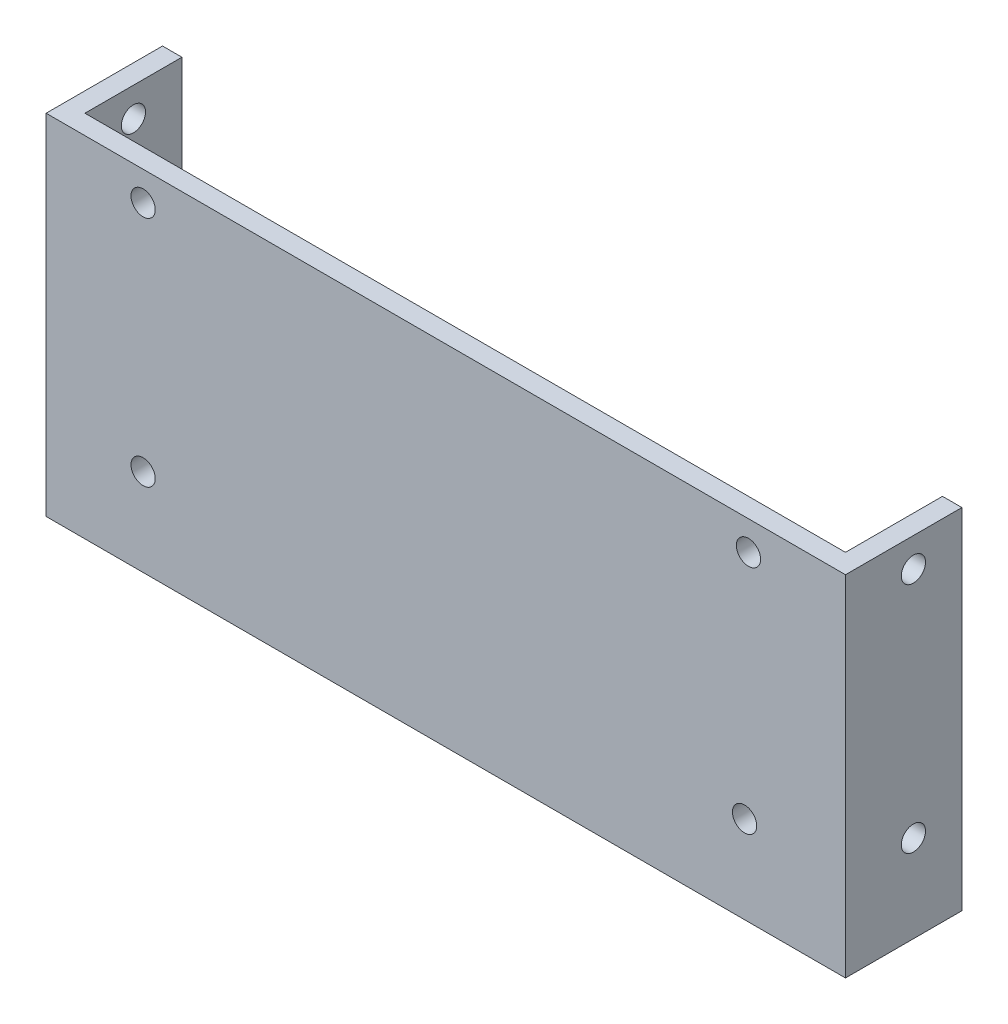
ISO-10303-21;
HEADER;
FILE_DESCRIPTION(('STEP AP214'),'2;1');
FILE_NAME('part.step','',(''),(''),'','','');
FILE_SCHEMA(('AUTOMOTIVE_DESIGN { 1 0 10303 214 1 1 1 1 }'));
ENDSEC;
DATA;
#1=APPLICATION_CONTEXT('core data for automotive mechanical design processes');
#2=APPLICATION_PROTOCOL_DEFINITION('international standard','automotive_design',2000,#1);
#3=PRODUCT_CONTEXT('',#1,'mechanical');
#4=PRODUCT('Part','Part','',(#3));
#5=PRODUCT_RELATED_PRODUCT_CATEGORY('part','',(#4));
#6=PRODUCT_DEFINITION_FORMATION('','',#4);
#7=PRODUCT_DEFINITION_CONTEXT('part definition',#1,'design');
#8=PRODUCT_DEFINITION('design','',#6,#7);
#9=PRODUCT_DEFINITION_SHAPE('','',#8);
#10=(LENGTH_UNIT() NAMED_UNIT(*) SI_UNIT(.MILLI.,.METRE.));
#11=(NAMED_UNIT(*) PLANE_ANGLE_UNIT() SI_UNIT($,.RADIAN.));
#12=(NAMED_UNIT(*) SI_UNIT($,.STERADIAN.) SOLID_ANGLE_UNIT());
#13=UNCERTAINTY_MEASURE_WITH_UNIT(LENGTH_MEASURE(1.E-05),#10,'distance_accuracy_value','');
#14=(GEOMETRIC_REPRESENTATION_CONTEXT(3) GLOBAL_UNCERTAINTY_ASSIGNED_CONTEXT((#13)) GLOBAL_UNIT_ASSIGNED_CONTEXT((#10,
#11,#12)) REPRESENTATION_CONTEXT('',''));
#15=CARTESIAN_POINT('',(0.,0.,0.));
#16=DIRECTION('',(0.,0.,1.));
#17=DIRECTION('',(1.,0.,0.));
#18=AXIS2_PLACEMENT_3D('',#15,#16,#17);
#19=CARTESIAN_POINT('',(0.,0.,2.));
#20=DIRECTION('',(1.,0.,0.));
#21=DIRECTION('',(0.,0.,-1.));
#22=AXIS2_PLACEMENT_3D('',#19,#20,#21);
#23=PLANE('',#22);
#24=CARTESIAN_POINT('',(0.,-21.0000000000001,-4.99999999999991));
#25=DIRECTION('',(-1.,0.,0.));
#26=DIRECTION('',(0.,0.,1.));
#27=AXIS2_PLACEMENT_3D('',#24,#25,#26);
#28=CIRCLE('',#27,1.25);
#29=CARTESIAN_POINT('',(0.,-21.0000000000001,-3.74999999999991));
#30=VERTEX_POINT('',#29);
#31=EDGE_CURVE('E228',#30,#30,#28,.T.);
#32=ORIENTED_EDGE('',*,*,#31,.F.);
#33=EDGE_LOOP('',(#32));
#34=FACE_BOUND('',#33,.T.);
#35=CARTESIAN_POINT('',(0.,3.,-5.));
#36=DIRECTION('',(1.,0.,0.));
#37=DIRECTION('',(0.,0.,-1.));
#38=AXIS2_PLACEMENT_3D('',#35,#36,#37);
#39=CIRCLE('',#38,1.25);
#40=CARTESIAN_POINT('',(0.,3.,-6.25));
#41=VERTEX_POINT('',#40);
#42=EDGE_CURVE('E147',#41,#41,#39,.T.);
#43=ORIENTED_EDGE('',*,*,#42,.T.);
#44=EDGE_LOOP('',(#43));
#45=FACE_BOUND('',#44,.T.);
#46=DIRECTION('',(0.,0.,-1.));
#47=VECTOR('',#46,1.);
#48=CARTESIAN_POINT('',(0.,6.,2.));
#49=LINE('',#48,#47);
#50=CARTESIAN_POINT('',(0.,6.,2.));
#51=VERTEX_POINT('',#50);
#52=CARTESIAN_POINT('',(0.,6.,-10.));
#53=VERTEX_POINT('',#52);
#54=EDGE_CURVE('E49',#51,#53,#49,.T.);
#55=ORIENTED_EDGE('',*,*,#54,.T.);
#56=DIRECTION('',(0.,1.,0.));
#57=VECTOR('',#56,1.);
#58=CARTESIAN_POINT('',(0.,0.,-10.));
#59=LINE('',#58,#57);
#60=CARTESIAN_POINT('',(0.,-30.,-10.));
#61=VERTEX_POINT('',#60);
#62=EDGE_CURVE('E117',#61,#53,#59,.T.);
#63=ORIENTED_EDGE('',*,*,#62,.F.);
#64=DIRECTION('',(0.,0.,-1.));
#65=VECTOR('',#64,1.);
#66=CARTESIAN_POINT('',(0.,-30.,2.));
#67=LINE('',#66,#65);
#68=CARTESIAN_POINT('',(0.,-30.,2.));
#69=VERTEX_POINT('',#68);
#70=EDGE_CURVE('E115',#69,#61,#67,.T.);
#71=ORIENTED_EDGE('',*,*,#70,.F.);
#72=DIRECTION('',(0.,-1.,0.));
#73=VECTOR('',#72,1.);
#74=CARTESIAN_POINT('',(0.,0.,2.));
#75=LINE('',#74,#73);
#76=EDGE_CURVE('E105',#51,#69,#75,.T.);
#77=ORIENTED_EDGE('',*,*,#76,.F.);
#78=EDGE_LOOP('',(#55,#63,#71,#77));
#79=FACE_BOUND('',#78,.T.);
#80=ADVANCED_FACE('F41',(#34,#45,#79),#23,.F.);
#81=CARTESIAN_POINT('',(82.4,0.,2.));
#82=DIRECTION('',(-1.,0.,0.));
#83=DIRECTION('',(0.,0.,1.));
#84=AXIS2_PLACEMENT_3D('',#81,#82,#83);
#85=PLANE('',#84);
#86=CARTESIAN_POINT('',(82.4,-21.0000000000001,-4.99999999999991));
#87=DIRECTION('',(-1.,0.,0.));
#88=DIRECTION('',(0.,0.,1.));
#89=AXIS2_PLACEMENT_3D('',#86,#87,#88);
#90=CIRCLE('',#89,1.25);
#91=CARTESIAN_POINT('',(82.4,-21.0000000000001,-3.74999999999991));
#92=VERTEX_POINT('',#91);
#93=EDGE_CURVE('E230',#92,#92,#90,.T.);
#94=ORIENTED_EDGE('',*,*,#93,.T.);
#95=EDGE_LOOP('',(#94));
#96=FACE_BOUND('',#95,.T.);
#97=CARTESIAN_POINT('',(82.4,3.,-5.));
#98=DIRECTION('',(-1.,0.,0.));
#99=DIRECTION('',(0.,0.,1.));
#100=AXIS2_PLACEMENT_3D('',#97,#98,#99);
#101=CIRCLE('',#100,1.25);
#102=CARTESIAN_POINT('',(82.4,3.,-6.25));
#103=VERTEX_POINT('',#102);
#104=EDGE_CURVE('E154',#103,#103,#101,.T.);
#105=ORIENTED_EDGE('',*,*,#104,.T.);
#106=EDGE_LOOP('',(#105));
#107=FACE_BOUND('',#106,.T.);
#108=DIRECTION('',(0.,1.,0.));
#109=VECTOR('',#108,1.);
#110=CARTESIAN_POINT('',(82.4,0.,2.));
#111=LINE('',#110,#109);
#112=CARTESIAN_POINT('',(82.4,-30.,2.));
#113=VERTEX_POINT('',#112);
#114=CARTESIAN_POINT('',(82.4,6.,2.));
#115=VERTEX_POINT('',#114);
#116=EDGE_CURVE('E111',#113,#115,#111,.T.);
#117=ORIENTED_EDGE('',*,*,#116,.F.);
#118=DIRECTION('',(0.,0.,1.));
#119=VECTOR('',#118,1.);
#120=CARTESIAN_POINT('',(82.4,-30.,-10.));
#121=LINE('',#120,#119);
#122=CARTESIAN_POINT('',(82.4,-30.,-10.));
#123=VERTEX_POINT('',#122);
#124=EDGE_CURVE('E127',#123,#113,#121,.T.);
#125=ORIENTED_EDGE('',*,*,#124,.F.);
#126=DIRECTION('',(0.,-1.,0.));
#127=VECTOR('',#126,1.);
#128=CARTESIAN_POINT('',(82.4,0.,-10.));
#129=LINE('',#128,#127);
#130=CARTESIAN_POINT('',(82.4,6.,-10.));
#131=VERTEX_POINT('',#130);
#132=EDGE_CURVE('E185',#131,#123,#129,.T.);
#133=ORIENTED_EDGE('',*,*,#132,.F.);
#134=DIRECTION('',(0.,0.,-1.));
#135=VECTOR('',#134,1.);
#136=CARTESIAN_POINT('',(82.4,6.,2.));
#137=LINE('',#136,#135);
#138=EDGE_CURVE('E11',#115,#131,#137,.T.);
#139=ORIENTED_EDGE('',*,*,#138,.F.);
#140=EDGE_LOOP('',(#117,#125,#133,#139));
#141=FACE_BOUND('',#140,.T.);
#142=ADVANCED_FACE('F217',(#96,#107,#141),#85,.F.);
#143=CARTESIAN_POINT('',(0.,6.,2.));
#144=DIRECTION('',(0.,-1.,0.));
#145=DIRECTION('',(0.,0.,-1.));
#146=AXIS2_PLACEMENT_3D('',#143,#144,#145);
#147=PLANE('',#146);
#148=ORIENTED_EDGE('',*,*,#138,.T.);
#149=DIRECTION('',(1.,0.,0.));
#150=VECTOR('',#149,1.);
#151=CARTESIAN_POINT('',(82.4,6.,-10.));
#152=LINE('',#151,#150);
#153=CARTESIAN_POINT('',(80.4,6.,-10.));
#154=VERTEX_POINT('',#153);
#155=EDGE_CURVE('E182',#154,#131,#152,.T.);
#156=ORIENTED_EDGE('',*,*,#155,.F.);
#157=DIRECTION('',(0.,0.,1.));
#158=VECTOR('',#157,1.);
#159=CARTESIAN_POINT('',(80.4,6.,-10.));
#160=LINE('',#159,#158);
#161=CARTESIAN_POINT('',(80.4,6.,0.));
#162=VERTEX_POINT('',#161);
#163=EDGE_CURVE('E161',#154,#162,#160,.T.);
#164=ORIENTED_EDGE('',*,*,#163,.T.);
#165=DIRECTION('',(-1.,0.,0.));
#166=VECTOR('',#165,1.);
#167=CARTESIAN_POINT('',(0.,6.,0.));
#168=LINE('',#167,#166);
#169=CARTESIAN_POINT('',(2.,6.,0.));
#170=VERTEX_POINT('',#169);
#171=EDGE_CURVE('E112',#162,#170,#168,.T.);
#172=ORIENTED_EDGE('',*,*,#171,.T.);
#173=DIRECTION('',(0.,0.,1.));
#174=VECTOR('',#173,1.);
#175=CARTESIAN_POINT('',(2.,6.,-10.));
#176=LINE('',#175,#174);
#177=CARTESIAN_POINT('',(2.,6.,-10.));
#178=VERTEX_POINT('',#177);
#179=EDGE_CURVE('E175',#178,#170,#176,.T.);
#180=ORIENTED_EDGE('',*,*,#179,.F.);
#181=DIRECTION('',(1.,0.,0.));
#182=VECTOR('',#181,1.);
#183=CARTESIAN_POINT('',(0.,6.,-10.));
#184=LINE('',#183,#182);
#185=EDGE_CURVE('E171',#53,#178,#184,.T.);
#186=ORIENTED_EDGE('',*,*,#185,.F.);
#187=ORIENTED_EDGE('',*,*,#54,.F.);
#188=DIRECTION('',(-1.,0.,0.));
#189=VECTOR('',#188,1.);
#190=CARTESIAN_POINT('',(0.,6.,2.));
#191=LINE('',#190,#189);
#192=EDGE_CURVE('E65',#115,#51,#191,.T.);
#193=ORIENTED_EDGE('',*,*,#192,.F.);
#194=EDGE_LOOP('',(#148,#156,#164,#172,#180,#186,#187,#193));
#195=FACE_BOUND('',#194,.T.);
#196=ADVANCED_FACE('F223',(#195),#147,.F.);
#197=CARTESIAN_POINT('',(0.,0.,2.));
#198=DIRECTION('',(0.,0.,-1.));
#199=DIRECTION('',(-1.,0.,0.));
#200=AXIS2_PLACEMENT_3D('',#197,#198,#199);
#201=PLANE('',#200);
#202=CARTESIAN_POINT('',(10.,-21.,2.));
#203=DIRECTION('',(0.,0.,-1.));
#204=DIRECTION('',(-1.,0.,0.));
#205=AXIS2_PLACEMENT_3D('',#202,#203,#204);
#206=CIRCLE('',#205,1.25);
#207=CARTESIAN_POINT('',(8.75000000000001,-21.,2.));
#208=VERTEX_POINT('',#207);
#209=EDGE_CURVE('E231',#208,#208,#206,.T.);
#210=ORIENTED_EDGE('',*,*,#209,.T.);
#211=EDGE_LOOP('',(#210));
#212=FACE_BOUND('',#211,.T.);
#213=CARTESIAN_POINT('',(72.,-21.,2.));
#214=DIRECTION('',(0.,0.,-1.));
#215=DIRECTION('',(-1.,0.,0.));
#216=AXIS2_PLACEMENT_3D('',#213,#214,#215);
#217=CIRCLE('',#216,1.25);
#218=CARTESIAN_POINT('',(70.75,-21.,2.));
#219=VERTEX_POINT('',#218);
#220=EDGE_CURVE('E238',#219,#219,#217,.T.);
#221=ORIENTED_EDGE('',*,*,#220,.T.);
#222=EDGE_LOOP('',(#221));
#223=FACE_BOUND('',#222,.T.);
#224=CARTESIAN_POINT('',(10.,3.,2.));
#225=DIRECTION('',(0.,0.,1.));
#226=DIRECTION('',(1.,0.,0.));
#227=AXIS2_PLACEMENT_3D('',#224,#225,#226);
#228=CIRCLE('',#227,1.25);
#229=CARTESIAN_POINT('',(11.25,3.,2.));
#230=VERTEX_POINT('',#229);
#231=EDGE_CURVE('E158',#230,#230,#228,.T.);
#232=ORIENTED_EDGE('',*,*,#231,.F.);
#233=EDGE_LOOP('',(#232));
#234=FACE_BOUND('',#233,.T.);
#235=CARTESIAN_POINT('',(72.4,3.,2.));
#236=DIRECTION('',(0.,0.,1.));
#237=DIRECTION('',(1.,0.,0.));
#238=AXIS2_PLACEMENT_3D('',#235,#236,#237);
#239=CIRCLE('',#238,1.25);
#240=CARTESIAN_POINT('',(73.65,3.,2.));
#241=VERTEX_POINT('',#240);
#242=EDGE_CURVE('E157',#241,#241,#239,.T.);
#243=ORIENTED_EDGE('',*,*,#242,.F.);
#244=EDGE_LOOP('',(#243));
#245=FACE_BOUND('',#244,.T.);
#246=ORIENTED_EDGE('',*,*,#76,.T.);
#247=DIRECTION('',(-1.,0.,0.));
#248=VECTOR('',#247,1.);
#249=CARTESIAN_POINT('',(82.4,-30.,2.));
#250=LINE('',#249,#248);
#251=EDGE_CURVE('E109',#113,#69,#250,.T.);
#252=ORIENTED_EDGE('',*,*,#251,.F.);
#253=ORIENTED_EDGE('',*,*,#116,.T.);
#254=ORIENTED_EDGE('',*,*,#192,.T.);
#255=EDGE_LOOP('',(#246,#252,#253,#254));
#256=FACE_BOUND('',#255,.T.);
#257=ADVANCED_FACE('F107',(#212,#223,#234,#245,#256),#201,.F.);
#258=CARTESIAN_POINT('',(0.,0.,0.));
#259=DIRECTION('',(0.,0.,-1.));
#260=DIRECTION('',(-1.,0.,0.));
#261=AXIS2_PLACEMENT_3D('',#258,#259,#260);
#262=PLANE('',#261);
#263=CARTESIAN_POINT('',(10.,-21.,0.));
#264=DIRECTION('',(0.,0.,-1.));
#265=DIRECTION('',(-1.,0.,0.));
#266=AXIS2_PLACEMENT_3D('',#263,#264,#265);
#267=CIRCLE('',#266,1.25);
#268=CARTESIAN_POINT('',(8.75000000000001,-21.,0.));
#269=VERTEX_POINT('',#268);
#270=EDGE_CURVE('E235',#269,#269,#267,.T.);
#271=ORIENTED_EDGE('',*,*,#270,.F.);
#272=EDGE_LOOP('',(#271));
#273=FACE_BOUND('',#272,.T.);
#274=CARTESIAN_POINT('',(72.,-21.,0.));
#275=DIRECTION('',(0.,0.,-1.));
#276=DIRECTION('',(-1.,0.,0.));
#277=AXIS2_PLACEMENT_3D('',#274,#275,#276);
#278=CIRCLE('',#277,1.25);
#279=CARTESIAN_POINT('',(70.75,-21.,0.));
#280=VERTEX_POINT('',#279);
#281=EDGE_CURVE('E241',#280,#280,#278,.T.);
#282=ORIENTED_EDGE('',*,*,#281,.F.);
#283=EDGE_LOOP('',(#282));
#284=FACE_BOUND('',#283,.T.);
#285=CARTESIAN_POINT('',(10.,3.,0.));
#286=DIRECTION('',(0.,0.,-1.));
#287=DIRECTION('',(-1.,0.,0.));
#288=AXIS2_PLACEMENT_3D('',#285,#286,#287);
#289=CIRCLE('',#288,1.25);
#290=CARTESIAN_POINT('',(8.75,3.,0.));
#291=VERTEX_POINT('',#290);
#292=EDGE_CURVE('E162',#291,#291,#289,.F.);
#293=ORIENTED_EDGE('',*,*,#292,.T.);
#294=EDGE_LOOP('',(#293));
#295=FACE_BOUND('',#294,.T.);
#296=CARTESIAN_POINT('',(72.4,3.,0.));
#297=DIRECTION('',(0.,0.,-1.));
#298=DIRECTION('',(-1.,0.,0.));
#299=AXIS2_PLACEMENT_3D('',#296,#297,#298);
#300=CIRCLE('',#299,1.25);
#301=CARTESIAN_POINT('',(71.15,3.,0.));
#302=VERTEX_POINT('',#301);
#303=EDGE_CURVE('E165',#302,#302,#300,.F.);
#304=ORIENTED_EDGE('',*,*,#303,.T.);
#305=EDGE_LOOP('',(#304));
#306=FACE_BOUND('',#305,.T.);
#307=DIRECTION('',(0.,-1.,0.));
#308=VECTOR('',#307,1.);
#309=CARTESIAN_POINT('',(2.,6.,0.));
#310=LINE('',#309,#308);
#311=CARTESIAN_POINT('',(2.,-30.,0.));
#312=VERTEX_POINT('',#311);
#313=EDGE_CURVE('E57',#170,#312,#310,.T.);
#314=ORIENTED_EDGE('',*,*,#313,.F.);
#315=ORIENTED_EDGE('',*,*,#171,.F.);
#316=DIRECTION('',(0.,1.,0.));
#317=VECTOR('',#316,1.);
#318=CARTESIAN_POINT('',(80.4,6.,0.));
#319=LINE('',#318,#317);
#320=CARTESIAN_POINT('',(80.4,-30.,0.));
#321=VERTEX_POINT('',#320);
#322=EDGE_CURVE('E177',#321,#162,#319,.T.);
#323=ORIENTED_EDGE('',*,*,#322,.F.);
#324=DIRECTION('',(1.,0.,0.));
#325=VECTOR('',#324,1.);
#326=CARTESIAN_POINT('',(2.,-30.,0.));
#327=LINE('',#326,#325);
#328=EDGE_CURVE('E138',#312,#321,#327,.T.);
#329=ORIENTED_EDGE('',*,*,#328,.F.);
#330=EDGE_LOOP('',(#314,#315,#323,#329));
#331=FACE_BOUND('',#330,.T.);
#332=ADVANCED_FACE('F249',(#273,#284,#295,#306,#331),#262,.T.);
#333=CARTESIAN_POINT('',(80.4,6.,-10.));
#334=DIRECTION('',(1.,0.,0.));
#335=DIRECTION('',(0.,0.,-1.));
#336=AXIS2_PLACEMENT_3D('',#333,#334,#335);
#337=PLANE('',#336);
#338=CARTESIAN_POINT('',(80.4,-21.0000000000001,-4.99999999999991));
#339=DIRECTION('',(1.,0.,0.));
#340=DIRECTION('',(0.,0.,-1.));
#341=AXIS2_PLACEMENT_3D('',#338,#339,#340);
#342=CIRCLE('',#341,1.25);
#343=CARTESIAN_POINT('',(80.4,-21.0000000000001,-6.24999999999991));
#344=VERTEX_POINT('',#343);
#345=EDGE_CURVE('E128',#344,#344,#342,.T.);
#346=ORIENTED_EDGE('',*,*,#345,.T.);
#347=EDGE_LOOP('',(#346));
#348=FACE_BOUND('',#347,.T.);
#349=CARTESIAN_POINT('',(80.4,3.,-5.));
#350=DIRECTION('',(1.,0.,0.));
#351=DIRECTION('',(0.,0.,-1.));
#352=AXIS2_PLACEMENT_3D('',#349,#350,#351);
#353=CIRCLE('',#352,1.25);
#354=CARTESIAN_POINT('',(80.4,3.,-6.25));
#355=VERTEX_POINT('',#354);
#356=EDGE_CURVE('E151',#355,#355,#353,.T.);
#357=ORIENTED_EDGE('',*,*,#356,.T.);
#358=EDGE_LOOP('',(#357));
#359=FACE_BOUND('',#358,.T.);
#360=ORIENTED_EDGE('',*,*,#322,.T.);
#361=ORIENTED_EDGE('',*,*,#163,.F.);
#362=DIRECTION('',(0.,1.,0.));
#363=VECTOR('',#362,1.);
#364=CARTESIAN_POINT('',(80.4,6.,-10.));
#365=LINE('',#364,#363);
#366=CARTESIAN_POINT('',(80.4,-30.,-10.));
#367=VERTEX_POINT('',#366);
#368=EDGE_CURVE('E188',#367,#154,#365,.T.);
#369=ORIENTED_EDGE('',*,*,#368,.F.);
#370=DIRECTION('',(0.,0.,-1.));
#371=VECTOR('',#370,1.);
#372=CARTESIAN_POINT('',(80.4,-30.,0.));
#373=LINE('',#372,#371);
#374=EDGE_CURVE('E141',#321,#367,#373,.T.);
#375=ORIENTED_EDGE('',*,*,#374,.F.);
#376=EDGE_LOOP('',(#360,#361,#369,#375));
#377=FACE_BOUND('',#376,.T.);
#378=ADVANCED_FACE('F252',(#348,#359,#377),#337,.F.);
#379=CARTESIAN_POINT('',(0.,0.,-10.));
#380=DIRECTION('',(0.,0.,1.));
#381=DIRECTION('',(1.,0.,0.));
#382=AXIS2_PLACEMENT_3D('',#379,#380,#381);
#383=PLANE('',#382);
#384=ORIENTED_EDGE('',*,*,#132,.T.);
#385=DIRECTION('',(1.,0.,0.));
#386=VECTOR('',#385,1.);
#387=CARTESIAN_POINT('',(80.4,-30.,-10.));
#388=LINE('',#387,#386);
#389=EDGE_CURVE('E144',#367,#123,#388,.T.);
#390=ORIENTED_EDGE('',*,*,#389,.F.);
#391=ORIENTED_EDGE('',*,*,#368,.T.);
#392=ORIENTED_EDGE('',*,*,#155,.T.);
#393=EDGE_LOOP('',(#384,#390,#391,#392));
#394=FACE_BOUND('',#393,.T.);
#395=ADVANCED_FACE('F277',(#394),#383,.F.);
#396=CARTESIAN_POINT('',(2.,6.,-10.));
#397=DIRECTION('',(-1.,0.,0.));
#398=DIRECTION('',(0.,-1.,0.));
#399=AXIS2_PLACEMENT_3D('',#396,#397,#398);
#400=PLANE('',#399);
#401=CARTESIAN_POINT('',(2.,-21.0000000000001,-4.99999999999991));
#402=DIRECTION('',(-1.,0.,0.));
#403=DIRECTION('',(0.,-1.,0.));
#404=AXIS2_PLACEMENT_3D('',#401,#402,#403);
#405=CIRCLE('',#404,1.25);
#406=CARTESIAN_POINT('',(2.,-22.2500000000001,-4.99999999999991));
#407=VERTEX_POINT('',#406);
#408=EDGE_CURVE('E44',#407,#407,#405,.T.);
#409=ORIENTED_EDGE('',*,*,#408,.T.);
#410=EDGE_LOOP('',(#409));
#411=FACE_BOUND('',#410,.T.);
#412=CARTESIAN_POINT('',(2.,3.,-5.));
#413=DIRECTION('',(-1.,0.,0.));
#414=DIRECTION('',(0.,-1.,0.));
#415=AXIS2_PLACEMENT_3D('',#412,#413,#414);
#416=CIRCLE('',#415,1.25);
#417=CARTESIAN_POINT('',(2.,3.,-6.25));
#418=VERTEX_POINT('',#417);
#419=EDGE_CURVE('E150',#418,#418,#416,.T.);
#420=ORIENTED_EDGE('',*,*,#419,.T.);
#421=EDGE_LOOP('',(#420));
#422=FACE_BOUND('',#421,.T.);
#423=ORIENTED_EDGE('',*,*,#313,.T.);
#424=DIRECTION('',(0.,0.,1.));
#425=VECTOR('',#424,1.);
#426=CARTESIAN_POINT('',(2.,-30.,-10.));
#427=LINE('',#426,#425);
#428=CARTESIAN_POINT('',(2.,-30.,-10.));
#429=VERTEX_POINT('',#428);
#430=EDGE_CURVE('E135',#429,#312,#427,.T.);
#431=ORIENTED_EDGE('',*,*,#430,.F.);
#432=DIRECTION('',(0.,-1.,0.));
#433=VECTOR('',#432,1.);
#434=CARTESIAN_POINT('',(2.,6.,-10.));
#435=LINE('',#434,#433);
#436=EDGE_CURVE('E173',#178,#429,#435,.T.);
#437=ORIENTED_EDGE('',*,*,#436,.F.);
#438=ORIENTED_EDGE('',*,*,#179,.T.);
#439=EDGE_LOOP('',(#423,#431,#437,#438));
#440=FACE_BOUND('',#439,.T.);
#441=ADVANCED_FACE('F197',(#411,#422,#440),#400,.F.);
#442=CARTESIAN_POINT('',(0.,0.,-10.));
#443=DIRECTION('',(0.,0.,-1.));
#444=DIRECTION('',(-1.,0.,0.));
#445=AXIS2_PLACEMENT_3D('',#442,#443,#444);
#446=PLANE('',#445);
#447=ORIENTED_EDGE('',*,*,#62,.T.);
#448=ORIENTED_EDGE('',*,*,#185,.T.);
#449=ORIENTED_EDGE('',*,*,#436,.T.);
#450=DIRECTION('',(1.,0.,0.));
#451=VECTOR('',#450,1.);
#452=CARTESIAN_POINT('',(0.,-30.,-10.));
#453=LINE('',#452,#451);
#454=EDGE_CURVE('E121',#61,#429,#453,.T.);
#455=ORIENTED_EDGE('',*,*,#454,.F.);
#456=EDGE_LOOP('',(#447,#448,#449,#455));
#457=FACE_BOUND('',#456,.T.);
#458=ADVANCED_FACE('F262',(#457),#446,.T.);
#459=CARTESIAN_POINT('',(72.4,3.,-10.001));
#460=DIRECTION('',(0.,0.,1.));
#461=DIRECTION('',(1.,0.,0.));
#462=AXIS2_PLACEMENT_3D('',#459,#460,#461);
#463=CYLINDRICAL_SURFACE('',#462,1.25);
#464=ORIENTED_EDGE('',*,*,#303,.F.);
#465=EDGE_LOOP('',(#464));
#466=FACE_BOUND('',#465,.T.);
#467=ORIENTED_EDGE('',*,*,#242,.T.);
#468=EDGE_LOOP('',(#467));
#469=FACE_BOUND('',#468,.T.);
#470=ADVANCED_FACE('F211',(#466,#469),#463,.F.);
#471=CARTESIAN_POINT('',(10.,3.,-10.001));
#472=DIRECTION('',(0.,0.,1.));
#473=DIRECTION('',(1.,0.,0.));
#474=AXIS2_PLACEMENT_3D('',#471,#472,#473);
#475=CYLINDRICAL_SURFACE('',#474,1.25);
#476=ORIENTED_EDGE('',*,*,#292,.F.);
#477=EDGE_LOOP('',(#476));
#478=FACE_BOUND('',#477,.T.);
#479=ORIENTED_EDGE('',*,*,#231,.T.);
#480=EDGE_LOOP('',(#479));
#481=FACE_BOUND('',#480,.T.);
#482=ADVANCED_FACE('F203',(#478,#481),#475,.F.);
#483=CARTESIAN_POINT('',(0.,3.,-5.));
#484=DIRECTION('',(1.,0.,0.));
#485=DIRECTION('',(0.,0.,-1.));
#486=AXIS2_PLACEMENT_3D('',#483,#484,#485);
#487=CYLINDRICAL_SURFACE('',#486,1.25);
#488=CARTESIAN_POINT('',(0.,3.,-6.25));
#489=CARTESIAN_POINT('',(0.0208333333333333,3.,-6.25));
#490=CARTESIAN_POINT('',(0.0416666666666667,3.,-6.25));
#491=CARTESIAN_POINT('',(0.0833333333333334,3.,-6.25));
#492=CARTESIAN_POINT('',(0.104166666666667,3.,-6.25));
#493=CARTESIAN_POINT('',(0.145833333333333,3.,-6.25));
#494=CARTESIAN_POINT('',(0.166666666666667,3.,-6.25));
#495=CARTESIAN_POINT('',(0.208333333333333,3.,-6.25));
#496=CARTESIAN_POINT('',(0.229166666666667,3.,-6.25));
#497=CARTESIAN_POINT('',(0.270833333333333,3.,-6.25));
#498=CARTESIAN_POINT('',(0.291666666666667,3.,-6.25));
#499=CARTESIAN_POINT('',(0.333333333333333,3.,-6.25));
#500=CARTESIAN_POINT('',(0.354166666666667,3.,-6.25));
#501=CARTESIAN_POINT('',(0.395833333333333,3.,-6.25));
#502=CARTESIAN_POINT('',(0.416666666666667,3.,-6.25));
#503=CARTESIAN_POINT('',(0.458333333333333,3.,-6.25));
#504=CARTESIAN_POINT('',(0.479166666666667,3.,-6.25));
#505=CARTESIAN_POINT('',(0.520833333333333,3.,-6.25));
#506=CARTESIAN_POINT('',(0.541666666666667,3.,-6.25));
#507=CARTESIAN_POINT('',(0.583333333333333,3.,-6.25));
#508=CARTESIAN_POINT('',(0.604166666666667,3.,-6.25));
#509=CARTESIAN_POINT('',(0.645833333333334,3.,-6.25));
#510=CARTESIAN_POINT('',(0.666666666666667,3.,-6.25));
#511=CARTESIAN_POINT('',(0.708333333333333,3.,-6.25));
#512=CARTESIAN_POINT('',(0.729166666666667,3.,-6.25));
#513=CARTESIAN_POINT('',(0.770833333333334,3.,-6.25));
#514=CARTESIAN_POINT('',(0.791666666666667,3.,-6.25));
#515=CARTESIAN_POINT('',(0.833333333333334,3.,-6.25));
#516=CARTESIAN_POINT('',(0.854166666666667,3.,-6.25));
#517=CARTESIAN_POINT('',(0.895833333333334,3.,-6.25));
#518=CARTESIAN_POINT('',(0.916666666666667,3.,-6.25));
#519=CARTESIAN_POINT('',(0.958333333333334,3.,-6.25));
#520=CARTESIAN_POINT('',(0.979166666666667,3.,-6.25));
#521=CARTESIAN_POINT('',(1.02083333333333,3.,-6.25));
#522=CARTESIAN_POINT('',(1.04166666666667,3.,-6.25));
#523=CARTESIAN_POINT('',(1.08333333333333,3.,-6.25));
#524=CARTESIAN_POINT('',(1.10416666666667,3.,-6.25));
#525=CARTESIAN_POINT('',(1.14583333333333,3.,-6.25));
#526=CARTESIAN_POINT('',(1.16666666666667,3.,-6.25));
#527=CARTESIAN_POINT('',(1.20833333333333,3.,-6.25));
#528=CARTESIAN_POINT('',(1.22916666666667,3.,-6.25));
#529=CARTESIAN_POINT('',(1.27083333333333,3.,-6.25));
#530=CARTESIAN_POINT('',(1.29166666666667,3.,-6.25));
#531=CARTESIAN_POINT('',(1.33333333333333,3.,-6.25));
#532=CARTESIAN_POINT('',(1.35416666666667,3.,-6.25));
#533=CARTESIAN_POINT('',(1.39583333333333,3.,-6.25));
#534=CARTESIAN_POINT('',(1.41666666666667,3.,-6.25));
#535=CARTESIAN_POINT('',(1.45833333333333,3.,-6.25));
#536=CARTESIAN_POINT('',(1.47916666666667,3.,-6.25));
#537=CARTESIAN_POINT('',(1.52083333333333,3.,-6.25));
#538=CARTESIAN_POINT('',(1.54166666666667,3.,-6.25));
#539=CARTESIAN_POINT('',(1.58333333333333,3.,-6.25));
#540=CARTESIAN_POINT('',(1.60416666666667,3.,-6.25));
#541=CARTESIAN_POINT('',(1.64583333333333,3.,-6.25));
#542=CARTESIAN_POINT('',(1.66666666666667,3.,-6.25));
#543=CARTESIAN_POINT('',(1.70833333333333,3.,-6.25));
#544=CARTESIAN_POINT('',(1.72916666666667,3.,-6.25));
#545=CARTESIAN_POINT('',(1.77083333333333,3.,-6.25));
#546=CARTESIAN_POINT('',(1.79166666666667,3.,-6.25));
#547=CARTESIAN_POINT('',(1.83333333333333,3.,-6.25));
#548=CARTESIAN_POINT('',(1.85416666666667,3.,-6.25));
#549=CARTESIAN_POINT('',(1.89583333333333,3.,-6.25));
#550=CARTESIAN_POINT('',(1.91666666666667,3.,-6.25));
#551=CARTESIAN_POINT('',(1.95833333333333,3.,-6.25));
#552=CARTESIAN_POINT('',(1.97916666666667,3.,-6.25));
#553=CARTESIAN_POINT('',(2.,3.,-6.25));
#554=B_SPLINE_CURVE_WITH_KNOTS('',3,(#488,#489,#490,#491,#492,#493,#494,#495,#496,#497,#498,
#499,#500,#501,#502,#503,#504,#505,#506,#507,#508,#509,#510,#511,#512,#513,#514,#515,#516,#517,
#518,#519,#520,#521,#522,#523,#524,#525,#526,#527,#528,#529,#530,#531,#532,#533,#534,#535,#536,
#537,#538,#539,#540,#541,#542,#543,#544,#545,#546,#547,#548,#549,#550,#551,#552,#553),
.UNSPECIFIED.,.F.,.F.,(4,2,2,2,2,2,2,2,2,2,2,2,2,2,2,2,2,2,2,2,2,2,2,2,2,2,2,2,2,2,2,2,4),(0.,
0.0625,0.125,0.1875,0.25,0.3125,0.375,0.4375,0.5,0.5625,0.625,0.6875,0.75,0.8125,0.875,0.9375,
1.,1.0625,1.125,1.1875,1.25,1.3125,1.375,1.4375,1.5,1.5625,1.625,1.6875,1.75,1.8125,1.875,
1.9375,2.),.UNSPECIFIED.);
#555=EDGE_CURVE('BSEAM200',#41,#418,#554,.T.);
#556=ORIENTED_EDGE('',*,*,#42,.F.);
#557=ORIENTED_EDGE('',*,*,#419,.F.);
#558=ORIENTED_EDGE('',*,*,#555,.T.);
#559=ORIENTED_EDGE('',*,*,#555,.F.);
#560=EDGE_LOOP('',(#556,#558,#557,#559));
#561=FACE_BOUND('',#560,.T.);
#562=ADVANCED_FACE('F200',(#561),#487,.F.);
#563=CARTESIAN_POINT('',(80.4,3.,-6.25));
#564=CARTESIAN_POINT('',(80.4208333333333,3.,-6.25));
#565=CARTESIAN_POINT('',(80.4416666666667,3.,-6.25));
#566=CARTESIAN_POINT('',(80.4833333333333,3.,-6.25));
#567=CARTESIAN_POINT('',(80.5041666666666,3.,-6.25));
#568=CARTESIAN_POINT('',(80.5458333333333,3.,-6.25));
#569=CARTESIAN_POINT('',(80.5666666666667,3.,-6.25));
#570=CARTESIAN_POINT('',(80.6083333333333,3.,-6.25));
#571=CARTESIAN_POINT('',(80.6291666666666,3.,-6.25));
#572=CARTESIAN_POINT('',(80.6708333333333,3.,-6.25));
#573=CARTESIAN_POINT('',(80.6916666666667,3.,-6.25));
#574=CARTESIAN_POINT('',(80.7333333333333,3.,-6.25));
#575=CARTESIAN_POINT('',(80.7541666666666,3.,-6.25));
#576=CARTESIAN_POINT('',(80.7958333333333,3.,-6.25));
#577=CARTESIAN_POINT('',(80.8166666666667,3.,-6.25));
#578=CARTESIAN_POINT('',(80.8583333333333,3.,-6.25));
#579=CARTESIAN_POINT('',(80.8791666666666,3.,-6.25));
#580=CARTESIAN_POINT('',(80.9208333333333,3.,-6.25));
#581=CARTESIAN_POINT('',(80.9416666666667,3.,-6.25));
#582=CARTESIAN_POINT('',(80.9833333333333,3.,-6.25));
#583=CARTESIAN_POINT('',(81.0041666666667,3.,-6.25));
#584=CARTESIAN_POINT('',(81.0458333333333,3.,-6.25));
#585=CARTESIAN_POINT('',(81.0666666666667,3.,-6.25));
#586=CARTESIAN_POINT('',(81.1083333333333,3.,-6.25));
#587=CARTESIAN_POINT('',(81.1291666666667,3.,-6.25));
#588=CARTESIAN_POINT('',(81.1708333333333,3.,-6.25));
#589=CARTESIAN_POINT('',(81.1916666666667,3.,-6.25));
#590=CARTESIAN_POINT('',(81.2333333333333,3.,-6.25));
#591=CARTESIAN_POINT('',(81.2541666666667,3.,-6.25));
#592=CARTESIAN_POINT('',(81.2958333333333,3.,-6.25));
#593=CARTESIAN_POINT('',(81.3166666666667,3.,-6.25));
#594=CARTESIAN_POINT('',(81.3583333333333,3.,-6.25));
#595=CARTESIAN_POINT('',(81.3791666666667,3.,-6.25));
#596=CARTESIAN_POINT('',(81.4208333333333,3.,-6.25));
#597=CARTESIAN_POINT('',(81.4416666666667,3.,-6.25));
#598=CARTESIAN_POINT('',(81.4833333333333,3.,-6.25));
#599=CARTESIAN_POINT('',(81.5041666666667,3.,-6.25));
#600=CARTESIAN_POINT('',(81.5458333333333,3.,-6.25));
#601=CARTESIAN_POINT('',(81.5666666666667,3.,-6.25));
#602=CARTESIAN_POINT('',(81.6083333333333,3.,-6.25));
#603=CARTESIAN_POINT('',(81.6291666666667,3.,-6.25));
#604=CARTESIAN_POINT('',(81.6708333333333,3.,-6.25));
#605=CARTESIAN_POINT('',(81.6916666666667,3.,-6.25));
#606=CARTESIAN_POINT('',(81.7333333333333,3.,-6.25));
#607=CARTESIAN_POINT('',(81.7541666666667,3.,-6.25));
#608=CARTESIAN_POINT('',(81.7958333333333,3.,-6.25));
#609=CARTESIAN_POINT('',(81.8166666666667,3.,-6.25));
#610=CARTESIAN_POINT('',(81.8583333333333,3.,-6.25));
#611=CARTESIAN_POINT('',(81.8791666666667,3.,-6.25));
#612=CARTESIAN_POINT('',(81.9208333333333,3.,-6.25));
#613=CARTESIAN_POINT('',(81.9416666666667,3.,-6.25));
#614=CARTESIAN_POINT('',(81.9833333333333,3.,-6.25));
#615=CARTESIAN_POINT('',(82.0041666666667,3.,-6.25));
#616=CARTESIAN_POINT('',(82.0458333333333,3.,-6.25));
#617=CARTESIAN_POINT('',(82.0666666666667,3.,-6.25));
#618=CARTESIAN_POINT('',(82.1083333333333,3.,-6.25));
#619=CARTESIAN_POINT('',(82.1291666666667,3.,-6.25));
#620=CARTESIAN_POINT('',(82.1708333333333,3.,-6.25));
#621=CARTESIAN_POINT('',(82.1916666666667,3.,-6.25));
#622=CARTESIAN_POINT('',(82.2333333333333,3.,-6.25));
#623=CARTESIAN_POINT('',(82.2541666666667,3.,-6.25));
#624=CARTESIAN_POINT('',(82.2958333333333,3.,-6.25));
#625=CARTESIAN_POINT('',(82.3166666666667,3.,-6.25));
#626=CARTESIAN_POINT('',(82.3583333333333,3.,-6.25));
#627=CARTESIAN_POINT('',(82.3791666666667,3.,-6.25));
#628=CARTESIAN_POINT('',(82.4,3.,-6.25));
#629=B_SPLINE_CURVE_WITH_KNOTS('',3,(#563,#564,#565,#566,#567,#568,#569,#570,#571,#572,#573,
#574,#575,#576,#577,#578,#579,#580,#581,#582,#583,#584,#585,#586,#587,#588,#589,#590,#591,#592,
#593,#594,#595,#596,#597,#598,#599,#600,#601,#602,#603,#604,#605,#606,#607,#608,#609,#610,#611,
#612,#613,#614,#615,#616,#617,#618,#619,#620,#621,#622,#623,#624,#625,#626,#627,#628),
.UNSPECIFIED.,.F.,.F.,(4,2,2,2,2,2,2,2,2,2,2,2,2,2,2,2,2,2,2,2,2,2,2,2,2,2,2,2,2,2,2,2,4),(0.,
0.062500000000007,0.125,0.187500000000007,0.25,0.312500000000007,0.375,0.437500000000007,0.5,
0.562500000000007,0.625000000000014,0.687500000000008,0.750000000000015,0.812500000000008,
0.875000000000015,0.937500000000008,1.00000000000001,1.06250000000002,1.12500000000001,
1.18750000000002,1.25000000000002,1.31250000000002,1.37500000000002,1.43750000000002,
1.50000000000003,1.56250000000002,1.62500000000003,1.68750000000002,1.75000000000003,
1.81250000000002,1.87500000000003,1.93750000000002,2.00000000000003),.UNSPECIFIED.);
#630=EDGE_CURVE('BSEAM202',#355,#103,#629,.T.);
#631=ORIENTED_EDGE('',*,*,#356,.F.);
#632=ORIENTED_EDGE('',*,*,#104,.F.);
#633=ORIENTED_EDGE('',*,*,#630,.T.);
#634=ORIENTED_EDGE('',*,*,#630,.F.);
#635=EDGE_LOOP('',(#631,#633,#632,#634));
#636=FACE_BOUND('',#635,.T.);
#637=ADVANCED_FACE('F202',(#636),#487,.F.);
#638=CARTESIAN_POINT('',(0.,-30.,0.));
#639=DIRECTION('',(0.,-1.,0.));
#640=DIRECTION('',(0.,0.,-1.));
#641=AXIS2_PLACEMENT_3D('',#638,#639,#640);
#642=PLANE('',#641);
#643=ORIENTED_EDGE('',*,*,#251,.T.);
#644=ORIENTED_EDGE('',*,*,#70,.T.);
#645=ORIENTED_EDGE('',*,*,#454,.T.);
#646=ORIENTED_EDGE('',*,*,#430,.T.);
#647=ORIENTED_EDGE('',*,*,#328,.T.);
#648=ORIENTED_EDGE('',*,*,#374,.T.);
#649=ORIENTED_EDGE('',*,*,#389,.T.);
#650=ORIENTED_EDGE('',*,*,#124,.T.);
#651=EDGE_LOOP('',(#643,#644,#645,#646,#647,#648,#649,#650));
#652=FACE_BOUND('',#651,.T.);
#653=ADVANCED_FACE('F124',(#652),#642,.T.);
#654=CARTESIAN_POINT('',(82.4,-21.0000000000001,-4.99999999999991));
#655=DIRECTION('',(-1.,0.,0.));
#656=DIRECTION('',(0.,0.,1.));
#657=AXIS2_PLACEMENT_3D('',#654,#655,#656);
#658=CYLINDRICAL_SURFACE('',#657,1.25);
#659=ORIENTED_EDGE('',*,*,#31,.T.);
#660=EDGE_LOOP('',(#659));
#661=FACE_BOUND('',#660,.T.);
#662=ORIENTED_EDGE('',*,*,#408,.F.);
#663=EDGE_LOOP('',(#662));
#664=FACE_BOUND('',#663,.T.);
#665=ADVANCED_FACE('F312',(#661,#664),#658,.F.);
#666=ORIENTED_EDGE('',*,*,#93,.F.);
#667=EDGE_LOOP('',(#666));
#668=FACE_BOUND('',#667,.T.);
#669=ORIENTED_EDGE('',*,*,#345,.F.);
#670=EDGE_LOOP('',(#669));
#671=FACE_BOUND('',#670,.T.);
#672=ADVANCED_FACE('F324',(#668,#671),#658,.F.);
#673=CARTESIAN_POINT('',(72.,-21.,2.));
#674=DIRECTION('',(0.,0.,-1.));
#675=DIRECTION('',(-1.,0.,0.));
#676=AXIS2_PLACEMENT_3D('',#673,#674,#675);
#677=CYLINDRICAL_SURFACE('',#676,1.25);
#678=ORIENTED_EDGE('',*,*,#220,.F.);
#679=EDGE_LOOP('',(#678));
#680=FACE_BOUND('',#679,.T.);
#681=ORIENTED_EDGE('',*,*,#281,.T.);
#682=EDGE_LOOP('',(#681));
#683=FACE_BOUND('',#682,.T.);
#684=ADVANCED_FACE('F332',(#680,#683),#677,.F.);
#685=CARTESIAN_POINT('',(10.,-21.,2.));
#686=DIRECTION('',(0.,0.,-1.));
#687=DIRECTION('',(-1.,0.,0.));
#688=AXIS2_PLACEMENT_3D('',#685,#686,#687);
#689=CYLINDRICAL_SURFACE('',#688,1.25);
#690=ORIENTED_EDGE('',*,*,#209,.F.);
#691=EDGE_LOOP('',(#690));
#692=FACE_BOUND('',#691,.T.);
#693=ORIENTED_EDGE('',*,*,#270,.T.);
#694=EDGE_LOOP('',(#693));
#695=FACE_BOUND('',#694,.T.);
#696=ADVANCED_FACE('F247',(#692,#695),#689,.F.);
#697=CLOSED_SHELL('',(#80,#142,#196,#257,#332,#378,#395,#441,#458,#470,#482,#562,#637,#653,#665,
#672,#684,#696));
#698=MANIFOLD_SOLID_BREP('B2',#697);
#699=ADVANCED_BREP_SHAPE_REPRESENTATION('',(#18,#698),#14);
#700=SHAPE_DEFINITION_REPRESENTATION(#9,#699);
ENDSEC;
END-ISO-10303-21;
